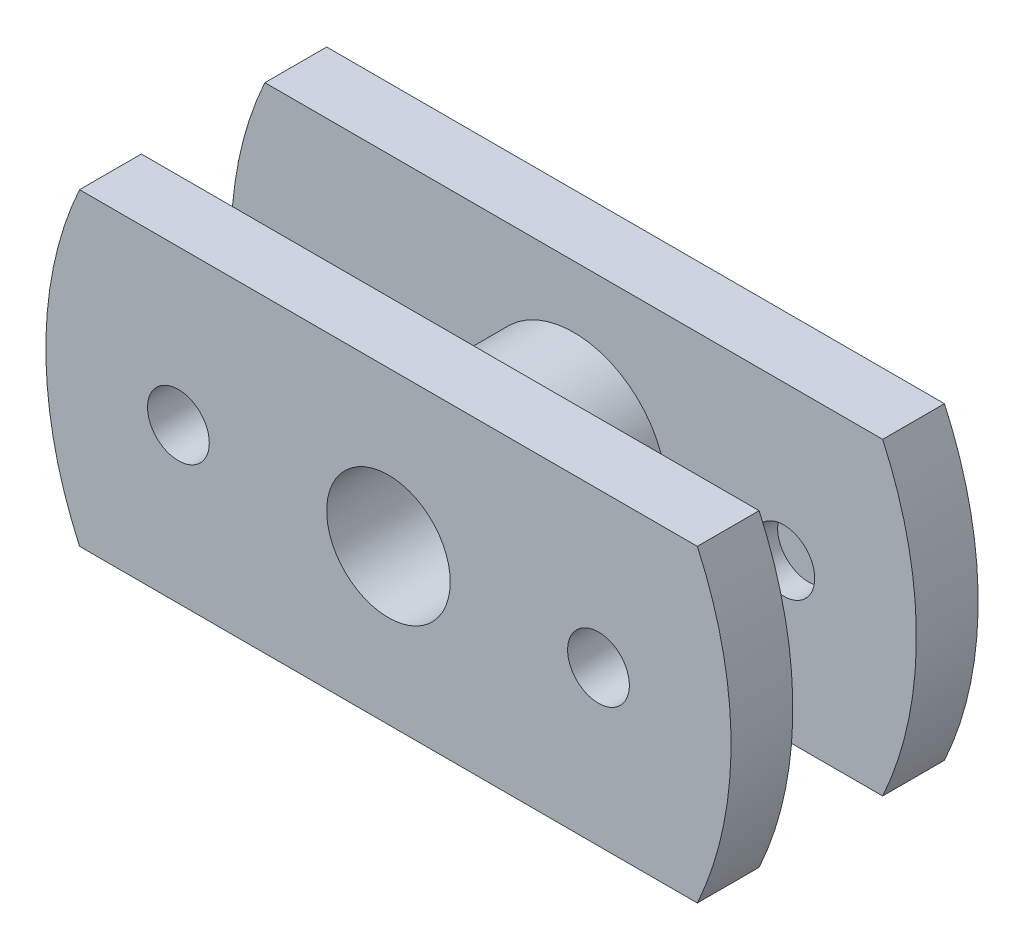
ISO-10303-21;
HEADER;
FILE_DESCRIPTION(('STEP AP214'),'2;1');
FILE_NAME('part.step','',(''),(''),'','','');
FILE_SCHEMA(('AUTOMOTIVE_DESIGN { 1 0 10303 214 1 1 1 1 }'));
ENDSEC;
DATA;
#1=APPLICATION_CONTEXT('core data for automotive mechanical design processes');
#2=APPLICATION_PROTOCOL_DEFINITION('international standard','automotive_design',2000,#1);
#3=PRODUCT_CONTEXT('',#1,'mechanical');
#4=PRODUCT('Part','Part','',(#3));
#5=PRODUCT_RELATED_PRODUCT_CATEGORY('part','',(#4));
#6=PRODUCT_DEFINITION_FORMATION('','',#4);
#7=PRODUCT_DEFINITION_CONTEXT('part definition',#1,'design');
#8=PRODUCT_DEFINITION('design','',#6,#7);
#9=PRODUCT_DEFINITION_SHAPE('','',#8);
#10=(LENGTH_UNIT() NAMED_UNIT(*) SI_UNIT(.MILLI.,.METRE.));
#11=(NAMED_UNIT(*) PLANE_ANGLE_UNIT() SI_UNIT($,.RADIAN.));
#12=(NAMED_UNIT(*) SI_UNIT($,.STERADIAN.) SOLID_ANGLE_UNIT());
#13=UNCERTAINTY_MEASURE_WITH_UNIT(LENGTH_MEASURE(1.E-05),#10,'distance_accuracy_value','');
#14=(GEOMETRIC_REPRESENTATION_CONTEXT(3) GLOBAL_UNCERTAINTY_ASSIGNED_CONTEXT((#13)) GLOBAL_UNIT_ASSIGNED_CONTEXT((#10,
#11,#12)) REPRESENTATION_CONTEXT('',''));
#15=CARTESIAN_POINT('',(0.,0.,0.));
#16=DIRECTION('',(0.,0.,1.));
#17=DIRECTION('',(1.,0.,0.));
#18=AXIS2_PLACEMENT_3D('',#15,#16,#17);
#19=CARTESIAN_POINT('',(-2.27178028658927,0.,5.));
#20=DIRECTION('',(0.,0.,-1.));
#21=DIRECTION('',(-1.,0.,0.));
#22=AXIS2_PLACEMENT_3D('',#19,#20,#21);
#23=CYLINDRICAL_SURFACE('',#22,30.);
#24=CARTESIAN_POINT('',(-2.27178028658927,0.,0.));
#25=DIRECTION('',(0.,0.,1.));
#26=DIRECTION('',(-1.,0.,0.));
#27=AXIS2_PLACEMENT_3D('',#24,#25,#26);
#28=CIRCLE('',#27,30.);
#29=CARTESIAN_POINT('',(25.,-12.5,0.));
#30=VERTEX_POINT('',#29);
#31=CARTESIAN_POINT('',(25.,12.5,0.));
#32=VERTEX_POINT('',#31);
#33=EDGE_CURVE('E159',#30,#32,#28,.T.);
#34=ORIENTED_EDGE('',*,*,#33,.T.);
#35=DIRECTION('',(0.,0.,-1.));
#36=VECTOR('',#35,1.);
#37=CARTESIAN_POINT('',(25.,12.5,5.));
#38=LINE('',#37,#36);
#39=CARTESIAN_POINT('',(25.,12.5,5.));
#40=VERTEX_POINT('',#39);
#41=EDGE_CURVE('E42',#40,#32,#38,.T.);
#42=ORIENTED_EDGE('',*,*,#41,.F.);
#43=CARTESIAN_POINT('',(-2.27178028658927,0.,5.));
#44=DIRECTION('',(0.,0.,1.));
#45=DIRECTION('',(-1.,0.,0.));
#46=AXIS2_PLACEMENT_3D('',#43,#44,#45);
#47=CIRCLE('',#46,30.);
#48=CARTESIAN_POINT('',(25.,-12.5,5.));
#49=VERTEX_POINT('',#48);
#50=EDGE_CURVE('E167',#49,#40,#47,.T.);
#51=ORIENTED_EDGE('',*,*,#50,.F.);
#52=DIRECTION('',(0.,0.,-1.));
#53=VECTOR('',#52,1.);
#54=CARTESIAN_POINT('',(25.,-12.5,5.));
#55=LINE('',#54,#53);
#56=EDGE_CURVE('E177',#49,#30,#55,.T.);
#57=ORIENTED_EDGE('',*,*,#56,.T.);
#58=EDGE_LOOP('',(#34,#42,#51,#57));
#59=FACE_BOUND('',#58,.T.);
#60=ADVANCED_FACE('F39',(#59),#23,.T.);
#61=CARTESIAN_POINT('',(-25.,12.5,5.));
#62=DIRECTION('',(0.,-1.,0.));
#63=DIRECTION('',(0.,0.,-1.));
#64=AXIS2_PLACEMENT_3D('',#61,#62,#63);
#65=PLANE('',#64);
#66=DIRECTION('',(-1.,0.,0.));
#67=VECTOR('',#66,1.);
#68=CARTESIAN_POINT('',(-25.,12.5,0.));
#69=LINE('',#68,#67);
#70=CARTESIAN_POINT('',(-25.,12.5,0.));
#71=VERTEX_POINT('',#70);
#72=EDGE_CURVE('E181',#32,#71,#69,.T.);
#73=ORIENTED_EDGE('',*,*,#72,.T.);
#74=DIRECTION('',(0.,0.,-1.));
#75=VECTOR('',#74,1.);
#76=CARTESIAN_POINT('',(-25.,12.5,5.));
#77=LINE('',#76,#75);
#78=CARTESIAN_POINT('',(-25.,12.5,5.));
#79=VERTEX_POINT('',#78);
#80=EDGE_CURVE('E192',#79,#71,#77,.T.);
#81=ORIENTED_EDGE('',*,*,#80,.F.);
#82=DIRECTION('',(-1.,0.,0.));
#83=VECTOR('',#82,1.);
#84=CARTESIAN_POINT('',(-25.,12.5,5.));
#85=LINE('',#84,#83);
#86=EDGE_CURVE('E89',#40,#79,#85,.T.);
#87=ORIENTED_EDGE('',*,*,#86,.F.);
#88=ORIENTED_EDGE('',*,*,#41,.T.);
#89=EDGE_LOOP('',(#73,#81,#87,#88));
#90=FACE_BOUND('',#89,.T.);
#91=ADVANCED_FACE('F197',(#90),#65,.F.);
#92=CARTESIAN_POINT('',(2.27178028658928,0.,5.));
#93=DIRECTION('',(0.,0.,-1.));
#94=DIRECTION('',(-1.,0.,0.));
#95=AXIS2_PLACEMENT_3D('',#92,#93,#94);
#96=CYLINDRICAL_SURFACE('',#95,30.);
#97=CARTESIAN_POINT('',(2.27178028658928,0.,0.));
#98=DIRECTION('',(0.,0.,1.));
#99=DIRECTION('',(1.,0.,0.));
#100=AXIS2_PLACEMENT_3D('',#97,#98,#99);
#101=CIRCLE('',#100,30.);
#102=CARTESIAN_POINT('',(-25.,-12.5,0.));
#103=VERTEX_POINT('',#102);
#104=EDGE_CURVE('E75',#71,#103,#101,.T.);
#105=ORIENTED_EDGE('',*,*,#104,.T.);
#106=DIRECTION('',(0.,0.,-1.));
#107=VECTOR('',#106,1.);
#108=CARTESIAN_POINT('',(-25.,-12.5,5.));
#109=LINE('',#108,#107);
#110=CARTESIAN_POINT('',(-25.,-12.5,5.));
#111=VERTEX_POINT('',#110);
#112=EDGE_CURVE('E190',#111,#103,#109,.T.);
#113=ORIENTED_EDGE('',*,*,#112,.F.);
#114=CARTESIAN_POINT('',(2.27178028658928,0.,5.));
#115=DIRECTION('',(0.,0.,1.));
#116=DIRECTION('',(1.,0.,0.));
#117=AXIS2_PLACEMENT_3D('',#114,#115,#116);
#118=CIRCLE('',#117,30.);
#119=EDGE_CURVE('E172',#79,#111,#118,.T.);
#120=ORIENTED_EDGE('',*,*,#119,.F.);
#121=ORIENTED_EDGE('',*,*,#80,.T.);
#122=EDGE_LOOP('',(#105,#113,#120,#121));
#123=FACE_BOUND('',#122,.T.);
#124=ADVANCED_FACE('F222',(#123),#96,.T.);
#125=CARTESIAN_POINT('',(-25.,-12.5,5.));
#126=DIRECTION('',(0.,1.,0.));
#127=DIRECTION('',(0.,0.,1.));
#128=AXIS2_PLACEMENT_3D('',#125,#126,#127);
#129=PLANE('',#128);
#130=DIRECTION('',(1.,0.,0.));
#131=VECTOR('',#130,1.);
#132=CARTESIAN_POINT('',(-25.,-12.5,0.));
#133=LINE('',#132,#131);
#134=EDGE_CURVE('E81',#103,#30,#133,.T.);
#135=ORIENTED_EDGE('',*,*,#134,.T.);
#136=ORIENTED_EDGE('',*,*,#56,.F.);
#137=DIRECTION('',(1.,0.,0.));
#138=VECTOR('',#137,1.);
#139=CARTESIAN_POINT('',(-25.,-12.5,5.));
#140=LINE('',#139,#138);
#141=EDGE_CURVE('E57',#111,#49,#140,.T.);
#142=ORIENTED_EDGE('',*,*,#141,.F.);
#143=ORIENTED_EDGE('',*,*,#112,.T.);
#144=EDGE_LOOP('',(#135,#136,#142,#143));
#145=FACE_BOUND('',#144,.T.);
#146=ADVANCED_FACE('F214',(#145),#129,.F.);
#147=CARTESIAN_POINT('',(-2.27178028658927,0.,5.));
#148=DIRECTION('',(0.,0.,-1.));
#149=DIRECTION('',(-1.,0.,0.));
#150=AXIS2_PLACEMENT_3D('',#147,#148,#149);
#151=PLANE('',#150);
#152=CARTESIAN_POINT('',(17.,0.,5.));
#153=DIRECTION('',(0.,0.,1.));
#154=DIRECTION('',(1.,0.,0.));
#155=AXIS2_PLACEMENT_3D('',#152,#153,#154);
#156=CIRCLE('',#155,2.5);
#157=CARTESIAN_POINT('',(19.5,0.,5.));
#158=VERTEX_POINT('',#157);
#159=EDGE_CURVE('E160',#158,#158,#156,.T.);
#160=ORIENTED_EDGE('',*,*,#159,.F.);
#161=EDGE_LOOP('',(#160));
#162=FACE_BOUND('',#161,.T.);
#163=CARTESIAN_POINT('',(-17.,0.,5.));
#164=DIRECTION('',(0.,0.,1.));
#165=DIRECTION('',(1.,0.,0.));
#166=AXIS2_PLACEMENT_3D('',#163,#164,#165);
#167=CIRCLE('',#166,2.5);
#168=CARTESIAN_POINT('',(-14.5,0.,5.));
#169=VERTEX_POINT('',#168);
#170=EDGE_CURVE('E144',#169,#169,#167,.T.);
#171=ORIENTED_EDGE('',*,*,#170,.F.);
#172=EDGE_LOOP('',(#171));
#173=FACE_BOUND('',#172,.T.);
#174=CARTESIAN_POINT('',(0.,0.,5.));
#175=DIRECTION('',(0.,0.,1.));
#176=DIRECTION('',(1.,0.,0.));
#177=AXIS2_PLACEMENT_3D('',#174,#175,#176);
#178=CIRCLE('',#177,7.5);
#179=CARTESIAN_POINT('',(7.5,0.,5.));
#180=VERTEX_POINT('',#179);
#181=EDGE_CURVE('E11',#180,#180,#178,.T.);
#182=ORIENTED_EDGE('',*,*,#181,.F.);
#183=EDGE_LOOP('',(#182));
#184=FACE_BOUND('',#183,.T.);
#185=ORIENTED_EDGE('',*,*,#50,.T.);
#186=ORIENTED_EDGE('',*,*,#86,.T.);
#187=ORIENTED_EDGE('',*,*,#119,.T.);
#188=ORIENTED_EDGE('',*,*,#141,.T.);
#189=EDGE_LOOP('',(#185,#186,#187,#188));
#190=FACE_BOUND('',#189,.T.);
#191=ADVANCED_FACE('F205',(#162,#173,#184,#190),#151,.F.);
#192=CARTESIAN_POINT('',(-2.27178028658927,0.,0.));
#193=DIRECTION('',(0.,0.,-1.));
#194=DIRECTION('',(-1.,0.,0.));
#195=AXIS2_PLACEMENT_3D('',#192,#193,#194);
#196=PLANE('',#195);
#197=ORIENTED_EDGE('',*,*,#33,.F.);
#198=ORIENTED_EDGE('',*,*,#134,.F.);
#199=ORIENTED_EDGE('',*,*,#104,.F.);
#200=ORIENTED_EDGE('',*,*,#72,.F.);
#201=EDGE_LOOP('',(#197,#198,#199,#200));
#202=FACE_BOUND('',#201,.T.);
#203=ADVANCED_FACE('F202',(#202),#196,.T.);
#204=CARTESIAN_POINT('',(0.,0.,15.));
#205=DIRECTION('',(0.,0.,-1.));
#206=DIRECTION('',(-1.,0.,0.));
#207=AXIS2_PLACEMENT_3D('',#204,#205,#206);
#208=CYLINDRICAL_SURFACE('',#207,7.5);
#209=CARTESIAN_POINT('',(0.,0.,15.));
#210=DIRECTION('',(0.,0.,1.));
#211=DIRECTION('',(1.,0.,0.));
#212=AXIS2_PLACEMENT_3D('',#209,#210,#211);
#213=CIRCLE('',#212,7.5);
#214=CARTESIAN_POINT('',(7.5,0.,15.));
#215=VERTEX_POINT('',#214);
#216=EDGE_CURVE('E411',#215,#215,#213,.T.);
#217=ORIENTED_EDGE('',*,*,#216,.F.);
#218=EDGE_LOOP('',(#217));
#219=FACE_BOUND('',#218,.T.);
#220=ORIENTED_EDGE('',*,*,#181,.T.);
#221=EDGE_LOOP('',(#220));
#222=FACE_BOUND('',#221,.T.);
#223=ADVANCED_FACE('F204',(#219,#222),#208,.T.);
#224=CARTESIAN_POINT('',(-17.,0.,3.));
#225=DIRECTION('',(0.,0.,1.));
#226=DIRECTION('',(1.,0.,0.));
#227=AXIS2_PLACEMENT_3D('',#224,#225,#226);
#228=CYLINDRICAL_SURFACE('',#227,2.5);
#229=CARTESIAN_POINT('',(-17.,0.,3.));
#230=DIRECTION('',(0.,0.,1.));
#231=DIRECTION('',(1.,0.,0.));
#232=AXIS2_PLACEMENT_3D('',#229,#230,#231);
#233=CIRCLE('',#232,2.5);
#234=CARTESIAN_POINT('',(-14.5,0.,3.));
#235=VERTEX_POINT('',#234);
#236=EDGE_CURVE('E149',#235,#235,#233,.T.);
#237=ORIENTED_EDGE('',*,*,#236,.F.);
#238=EDGE_LOOP('',(#237));
#239=FACE_BOUND('',#238,.T.);
#240=ORIENTED_EDGE('',*,*,#170,.T.);
#241=EDGE_LOOP('',(#240));
#242=FACE_BOUND('',#241,.T.);
#243=ADVANCED_FACE('F211',(#239,#242),#228,.F.);
#244=CARTESIAN_POINT('',(-17.,0.,3.));
#245=DIRECTION('',(0.,0.,1.));
#246=DIRECTION('',(1.,0.,0.));
#247=AXIS2_PLACEMENT_3D('',#244,#245,#246);
#248=PLANE('',#247);
#249=ORIENTED_EDGE('',*,*,#236,.T.);
#250=EDGE_LOOP('',(#249));
#251=FACE_BOUND('',#250,.T.);
#252=ADVANCED_FACE('F247',(#251),#248,.T.);
#253=CARTESIAN_POINT('',(17.,0.,3.));
#254=DIRECTION('',(0.,0.,1.));
#255=DIRECTION('',(1.,0.,0.));
#256=AXIS2_PLACEMENT_3D('',#253,#254,#255);
#257=CYLINDRICAL_SURFACE('',#256,2.5);
#258=CARTESIAN_POINT('',(17.,0.,3.));
#259=DIRECTION('',(0.,0.,1.));
#260=DIRECTION('',(1.,0.,0.));
#261=AXIS2_PLACEMENT_3D('',#258,#259,#260);
#262=CIRCLE('',#261,2.5);
#263=CARTESIAN_POINT('',(19.5,0.,3.));
#264=VERTEX_POINT('',#263);
#265=EDGE_CURVE('E155',#264,#264,#262,.T.);
#266=ORIENTED_EDGE('',*,*,#265,.F.);
#267=EDGE_LOOP('',(#266));
#268=FACE_BOUND('',#267,.T.);
#269=ORIENTED_EDGE('',*,*,#159,.T.);
#270=EDGE_LOOP('',(#269));
#271=FACE_BOUND('',#270,.T.);
#272=ADVANCED_FACE('F258',(#268,#271),#257,.F.);
#273=CARTESIAN_POINT('',(17.,0.,3.));
#274=DIRECTION('',(0.,0.,1.));
#275=DIRECTION('',(1.,0.,0.));
#276=AXIS2_PLACEMENT_3D('',#273,#274,#275);
#277=PLANE('',#276);
#278=ORIENTED_EDGE('',*,*,#265,.T.);
#279=EDGE_LOOP('',(#278));
#280=FACE_BOUND('',#279,.T.);
#281=ADVANCED_FACE('F268',(#280),#277,.T.);
#282=CARTESIAN_POINT('',(2.27178028658927,0.,15.));
#283=DIRECTION('',(0.,0.,-1.));
#284=DIRECTION('',(-1.,0.,0.));
#285=AXIS2_PLACEMENT_3D('',#282,#283,#284);
#286=PLANE('',#285);
#287=CARTESIAN_POINT('',(17.,0.,15.));
#288=DIRECTION('',(0.,0.,-1.));
#289=DIRECTION('',(-1.,0.,0.));
#290=AXIS2_PLACEMENT_3D('',#287,#288,#289);
#291=CIRCLE('',#290,2.5);
#292=CARTESIAN_POINT('',(14.5,0.,15.));
#293=VERTEX_POINT('',#292);
#294=EDGE_CURVE('E390',#293,#293,#291,.F.);
#295=ORIENTED_EDGE('',*,*,#294,.T.);
#296=EDGE_LOOP('',(#295));
#297=FACE_BOUND('',#296,.T.);
#298=CARTESIAN_POINT('',(-17.,0.,15.));
#299=DIRECTION('',(0.,0.,-1.));
#300=DIRECTION('',(-1.,0.,0.));
#301=AXIS2_PLACEMENT_3D('',#298,#299,#300);
#302=CIRCLE('',#301,2.5);
#303=CARTESIAN_POINT('',(-19.5,0.,15.));
#304=VERTEX_POINT('',#303);
#305=EDGE_CURVE('E402',#304,#304,#302,.F.);
#306=ORIENTED_EDGE('',*,*,#305,.T.);
#307=EDGE_LOOP('',(#306));
#308=FACE_BOUND('',#307,.T.);
#309=CARTESIAN_POINT('',(2.27178028658927,0.,15.));
#310=DIRECTION('',(0.,0.,1.));
#311=DIRECTION('',(-1.,0.,0.));
#312=AXIS2_PLACEMENT_3D('',#309,#310,#311);
#313=CIRCLE('',#312,30.);
#314=CARTESIAN_POINT('',(-25.,12.5,15.));
#315=VERTEX_POINT('',#314);
#316=CARTESIAN_POINT('',(-25.,-12.5,15.));
#317=VERTEX_POINT('',#316);
#318=EDGE_CURVE('E142',#315,#317,#313,.T.);
#319=ORIENTED_EDGE('',*,*,#318,.F.);
#320=DIRECTION('',(-1.,0.,0.));
#321=VECTOR('',#320,1.);
#322=CARTESIAN_POINT('',(25.,12.5,15.));
#323=LINE('',#322,#321);
#324=CARTESIAN_POINT('',(25.,12.5,15.));
#325=VERTEX_POINT('',#324);
#326=EDGE_CURVE('E138',#325,#315,#323,.T.);
#327=ORIENTED_EDGE('',*,*,#326,.F.);
#328=CARTESIAN_POINT('',(-2.27178028658951,0.,15.));
#329=DIRECTION('',(0.,0.,1.));
#330=DIRECTION('',(1.,0.,0.));
#331=AXIS2_PLACEMENT_3D('',#328,#329,#330);
#332=CIRCLE('',#331,30.0000000000002);
#333=CARTESIAN_POINT('',(25.,-12.5,15.));
#334=VERTEX_POINT('',#333);
#335=EDGE_CURVE('E426',#334,#325,#332,.T.);
#336=ORIENTED_EDGE('',*,*,#335,.F.);
#337=DIRECTION('',(1.,0.,0.));
#338=VECTOR('',#337,1.);
#339=CARTESIAN_POINT('',(25.,-12.5,15.));
#340=LINE('',#339,#338);
#341=EDGE_CURVE('E423',#317,#334,#340,.T.);
#342=ORIENTED_EDGE('',*,*,#341,.F.);
#343=EDGE_LOOP('',(#319,#327,#336,#342));
#344=FACE_BOUND('',#343,.T.);
#345=ORIENTED_EDGE('',*,*,#216,.T.);
#346=EDGE_LOOP('',(#345));
#347=FACE_BOUND('',#346,.T.);
#348=ADVANCED_FACE('F278',(#297,#308,#344,#347),#286,.T.);
#349=CARTESIAN_POINT('',(2.27178028658927,0.,20.));
#350=DIRECTION('',(0.,0.,-1.));
#351=DIRECTION('',(-1.,0.,0.));
#352=AXIS2_PLACEMENT_3D('',#349,#350,#351);
#353=CYLINDRICAL_SURFACE('',#352,30.);
#354=ORIENTED_EDGE('',*,*,#318,.T.);
#355=DIRECTION('',(0.,0.,-1.));
#356=VECTOR('',#355,1.);
#357=CARTESIAN_POINT('',(-25.,-12.5,20.));
#358=LINE('',#357,#356);
#359=CARTESIAN_POINT('',(-25.,-12.5,20.));
#360=VERTEX_POINT('',#359);
#361=EDGE_CURVE('E120',#360,#317,#358,.T.);
#362=ORIENTED_EDGE('',*,*,#361,.F.);
#363=CARTESIAN_POINT('',(2.27178028658927,0.,20.));
#364=DIRECTION('',(0.,0.,1.));
#365=DIRECTION('',(-1.,0.,0.));
#366=AXIS2_PLACEMENT_3D('',#363,#364,#365);
#367=CIRCLE('',#366,30.);
#368=CARTESIAN_POINT('',(-25.,12.5,20.));
#369=VERTEX_POINT('',#368);
#370=EDGE_CURVE('E128',#369,#360,#367,.T.);
#371=ORIENTED_EDGE('',*,*,#370,.F.);
#372=DIRECTION('',(0.,0.,-1.));
#373=VECTOR('',#372,1.);
#374=CARTESIAN_POINT('',(-25.,12.5,20.));
#375=LINE('',#374,#373);
#376=EDGE_CURVE('E420',#369,#315,#375,.T.);
#377=ORIENTED_EDGE('',*,*,#376,.T.);
#378=EDGE_LOOP('',(#354,#362,#371,#377));
#379=FACE_BOUND('',#378,.T.);
#380=ADVANCED_FACE('F140',(#379),#353,.T.);
#381=CARTESIAN_POINT('',(25.,-12.5,20.));
#382=DIRECTION('',(0.,1.,0.));
#383=DIRECTION('',(0.,0.,1.));
#384=AXIS2_PLACEMENT_3D('',#381,#382,#383);
#385=PLANE('',#384);
#386=ORIENTED_EDGE('',*,*,#341,.T.);
#387=DIRECTION('',(0.,0.,-1.));
#388=VECTOR('',#387,1.);
#389=CARTESIAN_POINT('',(25.,-12.5,20.));
#390=LINE('',#389,#388);
#391=CARTESIAN_POINT('',(25.,-12.5,20.));
#392=VERTEX_POINT('',#391);
#393=EDGE_CURVE('E123',#392,#334,#390,.T.);
#394=ORIENTED_EDGE('',*,*,#393,.F.);
#395=DIRECTION('',(1.,0.,0.));
#396=VECTOR('',#395,1.);
#397=CARTESIAN_POINT('',(25.,-12.5,20.));
#398=LINE('',#397,#396);
#399=EDGE_CURVE('E116',#360,#392,#398,.T.);
#400=ORIENTED_EDGE('',*,*,#399,.F.);
#401=ORIENTED_EDGE('',*,*,#361,.T.);
#402=EDGE_LOOP('',(#386,#394,#400,#401));
#403=FACE_BOUND('',#402,.T.);
#404=ADVANCED_FACE('F118',(#403),#385,.F.);
#405=CARTESIAN_POINT('',(-2.27178028658951,0.,20.));
#406=DIRECTION('',(0.,0.,-1.));
#407=DIRECTION('',(-1.,0.,0.));
#408=AXIS2_PLACEMENT_3D('',#405,#406,#407);
#409=CYLINDRICAL_SURFACE('',#408,30.0000000000002);
#410=ORIENTED_EDGE('',*,*,#335,.T.);
#411=DIRECTION('',(0.,0.,-1.));
#412=VECTOR('',#411,1.);
#413=CARTESIAN_POINT('',(25.,12.5,20.));
#414=LINE('',#413,#412);
#415=CARTESIAN_POINT('',(25.,12.5,20.));
#416=VERTEX_POINT('',#415);
#417=EDGE_CURVE('E151',#416,#325,#414,.T.);
#418=ORIENTED_EDGE('',*,*,#417,.F.);
#419=CARTESIAN_POINT('',(-2.27178028658951,0.,20.));
#420=DIRECTION('',(0.,0.,1.));
#421=DIRECTION('',(1.,0.,0.));
#422=AXIS2_PLACEMENT_3D('',#419,#420,#421);
#423=CIRCLE('',#422,30.0000000000002);
#424=EDGE_CURVE('E127',#392,#416,#423,.T.);
#425=ORIENTED_EDGE('',*,*,#424,.F.);
#426=ORIENTED_EDGE('',*,*,#393,.T.);
#427=EDGE_LOOP('',(#410,#418,#425,#426));
#428=FACE_BOUND('',#427,.T.);
#429=ADVANCED_FACE('F306',(#428),#409,.T.);
#430=CARTESIAN_POINT('',(25.,12.5,20.));
#431=DIRECTION('',(0.,-1.,0.));
#432=DIRECTION('',(0.,0.,-1.));
#433=AXIS2_PLACEMENT_3D('',#430,#431,#432);
#434=PLANE('',#433);
#435=ORIENTED_EDGE('',*,*,#326,.T.);
#436=ORIENTED_EDGE('',*,*,#376,.F.);
#437=DIRECTION('',(-1.,0.,0.));
#438=VECTOR('',#437,1.);
#439=CARTESIAN_POINT('',(25.,12.5,20.));
#440=LINE('',#439,#438);
#441=EDGE_CURVE('E133',#416,#369,#440,.T.);
#442=ORIENTED_EDGE('',*,*,#441,.F.);
#443=ORIENTED_EDGE('',*,*,#417,.T.);
#444=EDGE_LOOP('',(#435,#436,#442,#443));
#445=FACE_BOUND('',#444,.T.);
#446=ADVANCED_FACE('F315',(#445),#434,.F.);
#447=CARTESIAN_POINT('',(0.,0.,20.));
#448=DIRECTION('',(0.,0.,1.));
#449=DIRECTION('',(1.,0.,0.));
#450=AXIS2_PLACEMENT_3D('',#447,#448,#449);
#451=PLANE('',#450);
#452=CARTESIAN_POINT('',(17.,0.,20.));
#453=DIRECTION('',(0.,0.,1.));
#454=DIRECTION('',(1.,0.,0.));
#455=AXIS2_PLACEMENT_3D('',#452,#453,#454);
#456=CIRCLE('',#455,2.5);
#457=CARTESIAN_POINT('',(19.5,0.,20.));
#458=VERTEX_POINT('',#457);
#459=EDGE_CURVE('E387',#458,#458,#456,.T.);
#460=ORIENTED_EDGE('',*,*,#459,.F.);
#461=EDGE_LOOP('',(#460));
#462=FACE_BOUND('',#461,.T.);
#463=CARTESIAN_POINT('',(-17.,0.,20.));
#464=DIRECTION('',(0.,0.,1.));
#465=DIRECTION('',(1.,0.,0.));
#466=AXIS2_PLACEMENT_3D('',#463,#464,#465);
#467=CIRCLE('',#466,2.5);
#468=CARTESIAN_POINT('',(-14.5,0.,20.));
#469=VERTEX_POINT('',#468);
#470=EDGE_CURVE('E399',#469,#469,#467,.T.);
#471=ORIENTED_EDGE('',*,*,#470,.F.);
#472=EDGE_LOOP('',(#471));
#473=FACE_BOUND('',#472,.T.);
#474=CARTESIAN_POINT('',(0.,0.,20.));
#475=DIRECTION('',(0.,0.,1.));
#476=DIRECTION('',(1.,0.,0.));
#477=AXIS2_PLACEMENT_3D('',#474,#475,#476);
#478=CIRCLE('',#477,5.);
#479=CARTESIAN_POINT('',(5.,0.,20.));
#480=VERTEX_POINT('',#479);
#481=EDGE_CURVE('E392',#480,#480,#478,.T.);
#482=ORIENTED_EDGE('',*,*,#481,.F.);
#483=EDGE_LOOP('',(#482));
#484=FACE_BOUND('',#483,.T.);
#485=ORIENTED_EDGE('',*,*,#370,.T.);
#486=ORIENTED_EDGE('',*,*,#399,.T.);
#487=ORIENTED_EDGE('',*,*,#424,.T.);
#488=ORIENTED_EDGE('',*,*,#441,.T.);
#489=EDGE_LOOP('',(#485,#486,#487,#488));
#490=FACE_BOUND('',#489,.T.);
#491=ADVANCED_FACE('F131',(#462,#473,#484,#490),#451,.T.);
#492=CARTESIAN_POINT('',(0.,0.,5.));
#493=DIRECTION('',(0.,0.,1.));
#494=DIRECTION('',(1.,0.,0.));
#495=AXIS2_PLACEMENT_3D('',#492,#493,#494);
#496=CYLINDRICAL_SURFACE('',#495,5.);
#497=CARTESIAN_POINT('',(0.,0.,5.));
#498=DIRECTION('',(0.,0.,1.));
#499=DIRECTION('',(1.,0.,0.));
#500=AXIS2_PLACEMENT_3D('',#497,#498,#499);
#501=CIRCLE('',#500,5.);
#502=CARTESIAN_POINT('',(5.,0.,5.));
#503=VERTEX_POINT('',#502);
#504=EDGE_CURVE('E397',#503,#503,#501,.T.);
#505=ORIENTED_EDGE('',*,*,#504,.F.);
#506=EDGE_LOOP('',(#505));
#507=FACE_BOUND('',#506,.T.);
#508=ORIENTED_EDGE('',*,*,#481,.T.);
#509=EDGE_LOOP('',(#508));
#510=FACE_BOUND('',#509,.T.);
#511=ADVANCED_FACE('F331',(#507,#510),#496,.F.);
#512=CARTESIAN_POINT('',(0.,0.,5.));
#513=DIRECTION('',(0.,0.,1.));
#514=DIRECTION('',(1.,0.,0.));
#515=AXIS2_PLACEMENT_3D('',#512,#513,#514);
#516=PLANE('',#515);
#517=ORIENTED_EDGE('',*,*,#504,.T.);
#518=EDGE_LOOP('',(#517));
#519=FACE_BOUND('',#518,.T.);
#520=ADVANCED_FACE('F336',(#519),#516,.T.);
#521=CARTESIAN_POINT('',(-17.,0.,7.92893218813453));
#522=DIRECTION('',(0.,0.,1.));
#523=DIRECTION('',(1.,0.,0.));
#524=AXIS2_PLACEMENT_3D('',#521,#522,#523);
#525=CYLINDRICAL_SURFACE('',#524,2.5);
#526=ORIENTED_EDGE('',*,*,#470,.T.);
#527=EDGE_LOOP('',(#526));
#528=FACE_BOUND('',#527,.T.);
#529=ORIENTED_EDGE('',*,*,#305,.F.);
#530=EDGE_LOOP('',(#529));
#531=FACE_BOUND('',#530,.T.);
#532=ADVANCED_FACE('F346',(#528,#531),#525,.F.);
#533=CARTESIAN_POINT('',(17.,0.,7.92893218813453));
#534=DIRECTION('',(0.,0.,1.));
#535=DIRECTION('',(1.,0.,0.));
#536=AXIS2_PLACEMENT_3D('',#533,#534,#535);
#537=CYLINDRICAL_SURFACE('',#536,2.5);
#538=ORIENTED_EDGE('',*,*,#459,.T.);
#539=EDGE_LOOP('',(#538));
#540=FACE_BOUND('',#539,.T.);
#541=ORIENTED_EDGE('',*,*,#294,.F.);
#542=EDGE_LOOP('',(#541));
#543=FACE_BOUND('',#542,.T.);
#544=ADVANCED_FACE('F370',(#540,#543),#537,.F.);
#545=CLOSED_SHELL('',(#60,#91,#124,#146,#191,#203,#223,#243,#252,#272,#281,#348,#380,#404,#429,
#446,#491,#511,#520,#532,#544));
#546=MANIFOLD_SOLID_BREP('B2',#545);
#547=ADVANCED_BREP_SHAPE_REPRESENTATION('',(#18,#546),#14);
#548=SHAPE_DEFINITION_REPRESENTATION(#9,#547);
ENDSEC;
END-ISO-10303-21;
